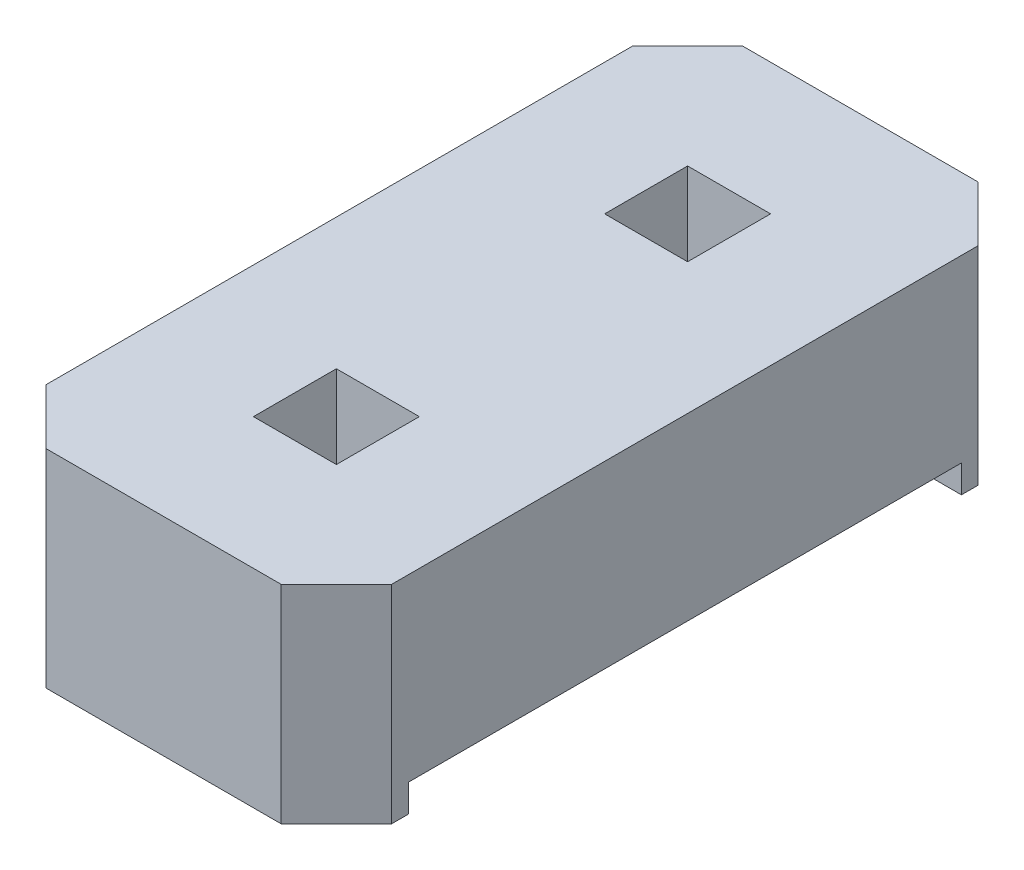
ISO-10303-21;
HEADER;
FILE_DESCRIPTION(('STEP AP214'),'2;1');
FILE_NAME('part.step','',(''),(''),'','','');
FILE_SCHEMA(('AUTOMOTIVE_DESIGN { 1 0 10303 214 1 1 1 1 }'));
ENDSEC;
DATA;
#1=APPLICATION_CONTEXT('core data for automotive mechanical design processes');
#2=APPLICATION_PROTOCOL_DEFINITION('international standard','automotive_design',2000,#1);
#3=PRODUCT_CONTEXT('',#1,'mechanical');
#4=PRODUCT('Part','Part','',(#3));
#5=PRODUCT_RELATED_PRODUCT_CATEGORY('part','',(#4));
#6=PRODUCT_DEFINITION_FORMATION('','',#4);
#7=PRODUCT_DEFINITION_CONTEXT('part definition',#1,'design');
#8=PRODUCT_DEFINITION('design','',#6,#7);
#9=PRODUCT_DEFINITION_SHAPE('','',#8);
#10=(LENGTH_UNIT() NAMED_UNIT(*) SI_UNIT(.MILLI.,.METRE.));
#11=(NAMED_UNIT(*) PLANE_ANGLE_UNIT() SI_UNIT($,.RADIAN.));
#12=(NAMED_UNIT(*) SI_UNIT($,.STERADIAN.) SOLID_ANGLE_UNIT());
#13=UNCERTAINTY_MEASURE_WITH_UNIT(LENGTH_MEASURE(1.E-05),#10,'distance_accuracy_value','');
#14=(GEOMETRIC_REPRESENTATION_CONTEXT(3) GLOBAL_UNCERTAINTY_ASSIGNED_CONTEXT((#13)) GLOBAL_UNIT_ASSIGNED_CONTEXT((#10,
#11,#12)) REPRESENTATION_CONTEXT('',''));
#15=CARTESIAN_POINT('',(0.,0.,0.));
#16=DIRECTION('',(0.,0.,1.));
#17=DIRECTION('',(1.,0.,0.));
#18=AXIS2_PLACEMENT_3D('',#15,#16,#17);
#19=CARTESIAN_POINT('',(0.,0.,0.));
#20=DIRECTION('',(0.,-1.,0.));
#21=DIRECTION('',(0.,0.,-1.));
#22=AXIS2_PLACEMENT_3D('',#19,#20,#21);
#23=PLANE('',#22);
#24=DIRECTION('',(-1.,0.,0.));
#25=VECTOR('',#24,1.);
#26=CARTESIAN_POINT('',(0.,0.,2.));
#27=LINE('',#26,#25);
#28=CARTESIAN_POINT('',(1.25,0.,2.));
#29=VERTEX_POINT('',#28);
#30=CARTESIAN_POINT('',(-1.25,0.,2.));
#31=VERTEX_POINT('',#30);
#32=EDGE_CURVE('E340',#29,#31,#27,.T.);
#33=ORIENTED_EDGE('',*,*,#32,.F.);
#34=DIRECTION('',(0.,0.,-1.));
#35=VECTOR('',#34,1.);
#36=CARTESIAN_POINT('',(1.25,0.,2.12));
#37=LINE('',#36,#35);
#38=CARTESIAN_POINT('',(1.25,0.,2.12));
#39=VERTEX_POINT('',#38);
#40=EDGE_CURVE('E190',#39,#29,#37,.T.);
#41=ORIENTED_EDGE('',*,*,#40,.F.);
#42=DIRECTION('',(0.707106781186547,0.,-0.707106781186548));
#43=VECTOR('',#42,1.);
#44=CARTESIAN_POINT('',(0.850000000000001,0.,2.52));
#45=LINE('',#44,#43);
#46=CARTESIAN_POINT('',(0.850000000000001,0.,2.52));
#47=VERTEX_POINT('',#46);
#48=EDGE_CURVE('E201',#47,#39,#45,.T.);
#49=ORIENTED_EDGE('',*,*,#48,.F.);
#50=DIRECTION('',(1.,0.,0.));
#51=VECTOR('',#50,1.);
#52=CARTESIAN_POINT('',(-0.85,0.,2.52));
#53=LINE('',#52,#51);
#54=CARTESIAN_POINT('',(-0.85,0.,2.52));
#55=VERTEX_POINT('',#54);
#56=EDGE_CURVE('E307',#55,#47,#53,.T.);
#57=ORIENTED_EDGE('',*,*,#56,.F.);
#58=DIRECTION('',(0.707106781186547,0.,0.707106781186548));
#59=VECTOR('',#58,1.);
#60=CARTESIAN_POINT('',(-1.25,0.,2.12));
#61=LINE('',#60,#59);
#62=CARTESIAN_POINT('',(-1.25,0.,2.12));
#63=VERTEX_POINT('',#62);
#64=EDGE_CURVE('E306',#63,#55,#61,.T.);
#65=ORIENTED_EDGE('',*,*,#64,.F.);
#66=DIRECTION('',(0.,0.,1.));
#67=VECTOR('',#66,1.);
#68=CARTESIAN_POINT('',(-1.25,0.,2.12));
#69=LINE('',#68,#67);
#70=EDGE_CURVE('E287',#31,#63,#69,.T.);
#71=ORIENTED_EDGE('',*,*,#70,.F.);
#72=EDGE_LOOP('',(#33,#41,#49,#57,#65,#71));
#73=FACE_BOUND('',#72,.T.);
#74=ADVANCED_FACE('F33',(#73),#23,.T.);
#75=CARTESIAN_POINT('',(0.,1.5,0.));
#76=DIRECTION('',(0.,-1.,0.));
#77=DIRECTION('',(0.,0.,-1.));
#78=AXIS2_PLACEMENT_3D('',#75,#76,#77);
#79=PLANE('',#78);
#80=DIRECTION('',(0.,0.,1.));
#81=VECTOR('',#80,1.);
#82=CARTESIAN_POINT('',(-0.3,1.5,0.97));
#83=LINE('',#82,#81);
#84=CARTESIAN_POINT('',(-0.3,1.5,0.97));
#85=VERTEX_POINT('',#84);
#86=CARTESIAN_POINT('',(-0.3,1.5,1.57));
#87=VERTEX_POINT('',#86);
#88=EDGE_CURVE('E266',#85,#87,#83,.T.);
#89=ORIENTED_EDGE('',*,*,#88,.F.);
#90=DIRECTION('',(-1.,0.,0.));
#91=VECTOR('',#90,1.);
#92=CARTESIAN_POINT('',(0.3,1.5,0.97));
#93=LINE('',#92,#91);
#94=CARTESIAN_POINT('',(0.3,1.5,0.97));
#95=VERTEX_POINT('',#94);
#96=EDGE_CURVE('E273',#95,#85,#93,.T.);
#97=ORIENTED_EDGE('',*,*,#96,.F.);
#98=DIRECTION('',(0.,0.,-1.));
#99=VECTOR('',#98,1.);
#100=CARTESIAN_POINT('',(0.3,1.5,0.97));
#101=LINE('',#100,#99);
#102=CARTESIAN_POINT('',(0.3,1.5,1.57));
#103=VERTEX_POINT('',#102);
#104=EDGE_CURVE('E270',#103,#95,#101,.T.);
#105=ORIENTED_EDGE('',*,*,#104,.F.);
#106=DIRECTION('',(1.,0.,0.));
#107=VECTOR('',#106,1.);
#108=CARTESIAN_POINT('',(0.3,1.5,1.57));
#109=LINE('',#108,#107);
#110=EDGE_CURVE('E268',#87,#103,#109,.T.);
#111=ORIENTED_EDGE('',*,*,#110,.F.);
#112=EDGE_LOOP('',(#89,#97,#105,#111));
#113=FACE_BOUND('',#112,.T.);
#114=DIRECTION('',(0.,0.,1.));
#115=VECTOR('',#114,1.);
#116=CARTESIAN_POINT('',(-1.25,1.5,2.12));
#117=LINE('',#116,#115);
#118=CARTESIAN_POINT('',(-1.25,1.5,-2.12));
#119=VERTEX_POINT('',#118);
#120=CARTESIAN_POINT('',(-1.25,1.5,2.12));
#121=VERTEX_POINT('',#120);
#122=EDGE_CURVE('E208',#119,#121,#117,.T.);
#123=ORIENTED_EDGE('',*,*,#122,.T.);
#124=DIRECTION('',(0.707106781186547,0.,0.707106781186548));
#125=VECTOR('',#124,1.);
#126=CARTESIAN_POINT('',(-1.25,1.5,2.12));
#127=LINE('',#126,#125);
#128=CARTESIAN_POINT('',(-0.85,1.5,2.52));
#129=VERTEX_POINT('',#128);
#130=EDGE_CURVE('E290',#121,#129,#127,.T.);
#131=ORIENTED_EDGE('',*,*,#130,.T.);
#132=DIRECTION('',(1.,0.,0.));
#133=VECTOR('',#132,1.);
#134=CARTESIAN_POINT('',(-0.85,1.5,2.52));
#135=LINE('',#134,#133);
#136=CARTESIAN_POINT('',(0.850000000000001,1.5,2.52));
#137=VERTEX_POINT('',#136);
#138=EDGE_CURVE('E292',#129,#137,#135,.T.);
#139=ORIENTED_EDGE('',*,*,#138,.T.);
#140=DIRECTION('',(0.707106781186547,0.,-0.707106781186548));
#141=VECTOR('',#140,1.);
#142=CARTESIAN_POINT('',(0.850000000000001,1.5,2.52));
#143=LINE('',#142,#141);
#144=CARTESIAN_POINT('',(1.25,1.5,2.12));
#145=VERTEX_POINT('',#144);
#146=EDGE_CURVE('E294',#137,#145,#143,.T.);
#147=ORIENTED_EDGE('',*,*,#146,.T.);
#148=DIRECTION('',(0.,0.,-1.));
#149=VECTOR('',#148,1.);
#150=CARTESIAN_POINT('',(1.25,1.5,2.12));
#151=LINE('',#150,#149);
#152=CARTESIAN_POINT('',(1.25,1.5,-2.12));
#153=VERTEX_POINT('',#152);
#154=EDGE_CURVE('E296',#145,#153,#151,.T.);
#155=ORIENTED_EDGE('',*,*,#154,.T.);
#156=DIRECTION('',(-0.707106781186547,0.,-0.707106781186548));
#157=VECTOR('',#156,1.);
#158=CARTESIAN_POINT('',(0.85,1.5,-2.52));
#159=LINE('',#158,#157);
#160=CARTESIAN_POINT('',(0.85,1.5,-2.52));
#161=VERTEX_POINT('',#160);
#162=EDGE_CURVE('E298',#153,#161,#159,.T.);
#163=ORIENTED_EDGE('',*,*,#162,.T.);
#164=DIRECTION('',(-1.,0.,0.));
#165=VECTOR('',#164,1.);
#166=CARTESIAN_POINT('',(-0.85,1.5,-2.52));
#167=LINE('',#166,#165);
#168=CARTESIAN_POINT('',(-0.85,1.5,-2.52));
#169=VERTEX_POINT('',#168);
#170=EDGE_CURVE('E300',#161,#169,#167,.T.);
#171=ORIENTED_EDGE('',*,*,#170,.T.);
#172=DIRECTION('',(-0.707106781186547,0.,0.707106781186548));
#173=VECTOR('',#172,1.);
#174=CARTESIAN_POINT('',(-1.25,1.5,-2.12));
#175=LINE('',#174,#173);
#176=EDGE_CURVE('E213',#169,#119,#175,.T.);
#177=ORIENTED_EDGE('',*,*,#176,.T.);
#178=EDGE_LOOP('',(#123,#131,#139,#147,#155,#163,#171,#177));
#179=FACE_BOUND('',#178,.T.);
#180=DIRECTION('',(1.,0.,0.));
#181=VECTOR('',#180,1.);
#182=CARTESIAN_POINT('',(0.3,1.5,-0.97));
#183=LINE('',#182,#181);
#184=CARTESIAN_POINT('',(-0.3,1.5,-0.97));
#185=VERTEX_POINT('',#184);
#186=CARTESIAN_POINT('',(0.3,1.5,-0.97));
#187=VERTEX_POINT('',#186);
#188=EDGE_CURVE('E342',#185,#187,#183,.T.);
#189=ORIENTED_EDGE('',*,*,#188,.F.);
#190=DIRECTION('',(0.,0.,1.));
#191=VECTOR('',#190,1.);
#192=CARTESIAN_POINT('',(-0.3,1.5,-0.97));
#193=LINE('',#192,#191);
#194=CARTESIAN_POINT('',(-0.3,1.5,-1.57));
#195=VERTEX_POINT('',#194);
#196=EDGE_CURVE('E254',#195,#185,#193,.T.);
#197=ORIENTED_EDGE('',*,*,#196,.F.);
#198=DIRECTION('',(-1.,0.,0.));
#199=VECTOR('',#198,1.);
#200=CARTESIAN_POINT('',(0.3,1.5,-1.57));
#201=LINE('',#200,#199);
#202=CARTESIAN_POINT('',(0.3,1.5,-1.57));
#203=VERTEX_POINT('',#202);
#204=EDGE_CURVE('E259',#203,#195,#201,.T.);
#205=ORIENTED_EDGE('',*,*,#204,.F.);
#206=DIRECTION('',(0.,0.,-1.));
#207=VECTOR('',#206,1.);
#208=CARTESIAN_POINT('',(0.3,1.5,-0.97));
#209=LINE('',#208,#207);
#210=EDGE_CURVE('E344',#187,#203,#209,.T.);
#211=ORIENTED_EDGE('',*,*,#210,.F.);
#212=EDGE_LOOP('',(#189,#197,#205,#211));
#213=FACE_BOUND('',#212,.T.);
#214=ADVANCED_FACE('F352',(#113,#179,#213),#79,.F.);
#215=DIRECTION('',(1.,0.,0.));
#216=VECTOR('',#215,1.);
#217=CARTESIAN_POINT('',(0.,0.,-2.));
#218=LINE('',#217,#216);
#219=CARTESIAN_POINT('',(-1.25,0.,-2.));
#220=VERTEX_POINT('',#219);
#221=CARTESIAN_POINT('',(1.25,0.,-2.));
#222=VERTEX_POINT('',#221);
#223=EDGE_CURVE('E338',#220,#222,#218,.T.);
#224=ORIENTED_EDGE('',*,*,#223,.F.);
#225=CARTESIAN_POINT('',(-1.25,0.,-2.12));
#226=VERTEX_POINT('',#225);
#227=EDGE_CURVE('E303',#226,#220,#69,.T.);
#228=ORIENTED_EDGE('',*,*,#227,.F.);
#229=DIRECTION('',(-0.707106781186547,0.,0.707106781186548));
#230=VECTOR('',#229,1.);
#231=CARTESIAN_POINT('',(-1.25,0.,-2.12));
#232=LINE('',#231,#230);
#233=CARTESIAN_POINT('',(-0.85,0.,-2.52));
#234=VERTEX_POINT('',#233);
#235=EDGE_CURVE('E206',#234,#226,#232,.T.);
#236=ORIENTED_EDGE('',*,*,#235,.F.);
#237=DIRECTION('',(-1.,0.,0.));
#238=VECTOR('',#237,1.);
#239=CARTESIAN_POINT('',(-0.85,0.,-2.52));
#240=LINE('',#239,#238);
#241=CARTESIAN_POINT('',(0.85,0.,-2.52));
#242=VERTEX_POINT('',#241);
#243=EDGE_CURVE('E199',#242,#234,#240,.T.);
#244=ORIENTED_EDGE('',*,*,#243,.F.);
#245=DIRECTION('',(-0.707106781186547,0.,-0.707106781186548));
#246=VECTOR('',#245,1.);
#247=CARTESIAN_POINT('',(0.85,0.,-2.52));
#248=LINE('',#247,#246);
#249=CARTESIAN_POINT('',(1.25,0.,-2.12));
#250=VERTEX_POINT('',#249);
#251=EDGE_CURVE('E196',#250,#242,#248,.T.);
#252=ORIENTED_EDGE('',*,*,#251,.F.);
#253=EDGE_CURVE('E197',#222,#250,#37,.T.);
#254=ORIENTED_EDGE('',*,*,#253,.F.);
#255=EDGE_LOOP('',(#224,#228,#236,#244,#252,#254));
#256=FACE_BOUND('',#255,.T.);
#257=ADVANCED_FACE('F366',(#256),#23,.T.);
#258=CARTESIAN_POINT('',(-1.25,1.5,2.12));
#259=DIRECTION('',(1.,0.,0.));
#260=DIRECTION('',(0.,0.,-1.));
#261=AXIS2_PLACEMENT_3D('',#258,#259,#260);
#262=PLANE('',#261);
#263=DIRECTION('',(0.,0.,-1.));
#264=VECTOR('',#263,1.);
#265=CARTESIAN_POINT('',(-1.25,0.2,-2.));
#266=LINE('',#265,#264);
#267=CARTESIAN_POINT('',(-1.25,0.2,2.));
#268=VERTEX_POINT('',#267);
#269=CARTESIAN_POINT('',(-1.25,0.2,-2.));
#270=VERTEX_POINT('',#269);
#271=EDGE_CURVE('E323',#268,#270,#266,.T.);
#272=ORIENTED_EDGE('',*,*,#271,.F.);
#273=DIRECTION('',(0.,1.,0.));
#274=VECTOR('',#273,1.);
#275=CARTESIAN_POINT('',(-1.25,-0.2,2.));
#276=LINE('',#275,#274);
#277=EDGE_CURVE('E174',#31,#268,#276,.T.);
#278=ORIENTED_EDGE('',*,*,#277,.F.);
#279=ORIENTED_EDGE('',*,*,#70,.T.);
#280=DIRECTION('',(0.,-1.,0.));
#281=VECTOR('',#280,1.);
#282=CARTESIAN_POINT('',(-1.25,1.5,2.12));
#283=LINE('',#282,#281);
#284=EDGE_CURVE('E229',#121,#63,#283,.T.);
#285=ORIENTED_EDGE('',*,*,#284,.F.);
#286=ORIENTED_EDGE('',*,*,#122,.F.);
#287=DIRECTION('',(0.,-1.,0.));
#288=VECTOR('',#287,1.);
#289=CARTESIAN_POINT('',(-1.25,1.5,-2.12));
#290=LINE('',#289,#288);
#291=EDGE_CURVE('E209',#119,#226,#290,.T.);
#292=ORIENTED_EDGE('',*,*,#291,.T.);
#293=ORIENTED_EDGE('',*,*,#227,.T.);
#294=DIRECTION('',(0.,-1.,0.));
#295=VECTOR('',#294,1.);
#296=CARTESIAN_POINT('',(-1.25,-0.2,-2.));
#297=LINE('',#296,#295);
#298=EDGE_CURVE('E184',#270,#220,#297,.T.);
#299=ORIENTED_EDGE('',*,*,#298,.F.);
#300=EDGE_LOOP('',(#272,#278,#279,#285,#286,#292,#293,#299));
#301=FACE_BOUND('',#300,.T.);
#302=ADVANCED_FACE('F35',(#301),#262,.F.);
#303=CARTESIAN_POINT('',(-1.25,1.5,2.12));
#304=DIRECTION('',(0.707106781186548,0.,-0.707106781186547));
#305=DIRECTION('',(-0.707106781186547,0.,-0.707106781186548));
#306=AXIS2_PLACEMENT_3D('',#303,#304,#305);
#307=PLANE('',#306);
#308=ORIENTED_EDGE('',*,*,#64,.T.);
#309=DIRECTION('',(0.,-1.,0.));
#310=VECTOR('',#309,1.);
#311=CARTESIAN_POINT('',(-0.85,1.5,2.52));
#312=LINE('',#311,#310);
#313=EDGE_CURVE('E226',#129,#55,#312,.T.);
#314=ORIENTED_EDGE('',*,*,#313,.F.);
#315=ORIENTED_EDGE('',*,*,#130,.F.);
#316=ORIENTED_EDGE('',*,*,#284,.T.);
#317=EDGE_LOOP('',(#308,#314,#315,#316));
#318=FACE_BOUND('',#317,.T.);
#319=ADVANCED_FACE('F319',(#318),#307,.F.);
#320=CARTESIAN_POINT('',(-0.85,1.5,2.52));
#321=DIRECTION('',(0.,0.,-1.));
#322=DIRECTION('',(-1.,0.,0.));
#323=AXIS2_PLACEMENT_3D('',#320,#321,#322);
#324=PLANE('',#323);
#325=ORIENTED_EDGE('',*,*,#56,.T.);
#326=DIRECTION('',(0.,-1.,0.));
#327=VECTOR('',#326,1.);
#328=CARTESIAN_POINT('',(0.850000000000001,1.5,2.52));
#329=LINE('',#328,#327);
#330=EDGE_CURVE('E223',#137,#47,#329,.T.);
#331=ORIENTED_EDGE('',*,*,#330,.F.);
#332=ORIENTED_EDGE('',*,*,#138,.F.);
#333=ORIENTED_EDGE('',*,*,#313,.T.);
#334=EDGE_LOOP('',(#325,#331,#332,#333));
#335=FACE_BOUND('',#334,.T.);
#336=ADVANCED_FACE('F399',(#335),#324,.F.);
#337=CARTESIAN_POINT('',(0.850000000000001,1.5,2.52));
#338=DIRECTION('',(-0.707106781186548,0.,-0.707106781186547));
#339=DIRECTION('',(-0.707106781186547,0.,0.707106781186548));
#340=AXIS2_PLACEMENT_3D('',#337,#338,#339);
#341=PLANE('',#340);
#342=ORIENTED_EDGE('',*,*,#48,.T.);
#343=DIRECTION('',(0.,-1.,0.));
#344=VECTOR('',#343,1.);
#345=CARTESIAN_POINT('',(1.25,1.5,2.12));
#346=LINE('',#345,#344);
#347=EDGE_CURVE('E193',#145,#39,#346,.T.);
#348=ORIENTED_EDGE('',*,*,#347,.F.);
#349=ORIENTED_EDGE('',*,*,#146,.F.);
#350=ORIENTED_EDGE('',*,*,#330,.T.);
#351=EDGE_LOOP('',(#342,#348,#349,#350));
#352=FACE_BOUND('',#351,.T.);
#353=ADVANCED_FACE('F312',(#352),#341,.F.);
#354=CARTESIAN_POINT('',(1.25,1.5,2.12));
#355=DIRECTION('',(-1.,0.,0.));
#356=DIRECTION('',(0.,0.,1.));
#357=AXIS2_PLACEMENT_3D('',#354,#355,#356);
#358=PLANE('',#357);
#359=ORIENTED_EDGE('',*,*,#40,.T.);
#360=DIRECTION('',(0.,1.,0.));
#361=VECTOR('',#360,1.);
#362=CARTESIAN_POINT('',(1.25,1.5,2.));
#363=LINE('',#362,#361);
#364=CARTESIAN_POINT('',(1.25,0.2,2.));
#365=VERTEX_POINT('',#364);
#366=EDGE_CURVE('E11',#29,#365,#363,.T.);
#367=ORIENTED_EDGE('',*,*,#366,.T.);
#368=DIRECTION('',(0.,0.,-1.));
#369=VECTOR('',#368,1.);
#370=CARTESIAN_POINT('',(1.25,0.2,-2.));
#371=LINE('',#370,#369);
#372=CARTESIAN_POINT('',(1.25,0.2,-2.));
#373=VERTEX_POINT('',#372);
#374=EDGE_CURVE('E181',#365,#373,#371,.T.);
#375=ORIENTED_EDGE('',*,*,#374,.T.);
#376=DIRECTION('',(0.,-1.,0.));
#377=VECTOR('',#376,1.);
#378=CARTESIAN_POINT('',(1.25,-0.2,-2.));
#379=LINE('',#378,#377);
#380=EDGE_CURVE('E48',#373,#222,#379,.T.);
#381=ORIENTED_EDGE('',*,*,#380,.T.);
#382=ORIENTED_EDGE('',*,*,#253,.T.);
#383=DIRECTION('',(0.,-1.,0.));
#384=VECTOR('',#383,1.);
#385=CARTESIAN_POINT('',(1.25,1.5,-2.12));
#386=LINE('',#385,#384);
#387=EDGE_CURVE('E219',#153,#250,#386,.T.);
#388=ORIENTED_EDGE('',*,*,#387,.F.);
#389=ORIENTED_EDGE('',*,*,#154,.F.);
#390=ORIENTED_EDGE('',*,*,#347,.T.);
#391=EDGE_LOOP('',(#359,#367,#375,#381,#382,#388,#389,#390));
#392=FACE_BOUND('',#391,.T.);
#393=ADVANCED_FACE('F187',(#392),#358,.F.);
#394=CARTESIAN_POINT('',(0.85,1.5,-2.52));
#395=DIRECTION('',(-0.707106781186548,0.,0.707106781186547));
#396=DIRECTION('',(0.707106781186547,0.,0.707106781186548));
#397=AXIS2_PLACEMENT_3D('',#394,#395,#396);
#398=PLANE('',#397);
#399=ORIENTED_EDGE('',*,*,#251,.T.);
#400=DIRECTION('',(0.,-1.,0.));
#401=VECTOR('',#400,1.);
#402=CARTESIAN_POINT('',(0.85,1.5,-2.52));
#403=LINE('',#402,#401);
#404=EDGE_CURVE('E216',#161,#242,#403,.T.);
#405=ORIENTED_EDGE('',*,*,#404,.F.);
#406=ORIENTED_EDGE('',*,*,#162,.F.);
#407=ORIENTED_EDGE('',*,*,#387,.T.);
#408=EDGE_LOOP('',(#399,#405,#406,#407));
#409=FACE_BOUND('',#408,.T.);
#410=ADVANCED_FACE('F395',(#409),#398,.F.);
#411=CARTESIAN_POINT('',(-0.85,1.5,-2.52));
#412=DIRECTION('',(0.,0.,1.));
#413=DIRECTION('',(1.,0.,0.));
#414=AXIS2_PLACEMENT_3D('',#411,#412,#413);
#415=PLANE('',#414);
#416=ORIENTED_EDGE('',*,*,#243,.T.);
#417=DIRECTION('',(0.,-1.,0.));
#418=VECTOR('',#417,1.);
#419=CARTESIAN_POINT('',(-0.85,1.5,-2.52));
#420=LINE('',#419,#418);
#421=EDGE_CURVE('E212',#169,#234,#420,.T.);
#422=ORIENTED_EDGE('',*,*,#421,.F.);
#423=ORIENTED_EDGE('',*,*,#170,.F.);
#424=ORIENTED_EDGE('',*,*,#404,.T.);
#425=EDGE_LOOP('',(#416,#422,#423,#424));
#426=FACE_BOUND('',#425,.T.);
#427=ADVANCED_FACE('F390',(#426),#415,.F.);
#428=CARTESIAN_POINT('',(-1.25,1.5,-2.12));
#429=DIRECTION('',(0.707106781186548,0.,0.707106781186547));
#430=DIRECTION('',(0.707106781186547,0.,-0.707106781186548));
#431=AXIS2_PLACEMENT_3D('',#428,#429,#430);
#432=PLANE('',#431);
#433=ORIENTED_EDGE('',*,*,#235,.T.);
#434=ORIENTED_EDGE('',*,*,#291,.F.);
#435=ORIENTED_EDGE('',*,*,#176,.F.);
#436=ORIENTED_EDGE('',*,*,#421,.T.);
#437=EDGE_LOOP('',(#433,#434,#435,#436));
#438=FACE_BOUND('',#437,.T.);
#439=ADVANCED_FACE('F386',(#438),#432,.F.);
#440=CARTESIAN_POINT('',(-0.3,1.5,0.97));
#441=DIRECTION('',(1.,0.,0.));
#442=DIRECTION('',(0.,0.,-1.));
#443=AXIS2_PLACEMENT_3D('',#440,#441,#442);
#444=PLANE('',#443);
#445=DIRECTION('',(0.,0.,1.));
#446=VECTOR('',#445,1.);
#447=CARTESIAN_POINT('',(-0.3,0.2,0.97));
#448=LINE('',#447,#446);
#449=CARTESIAN_POINT('',(-0.3,0.2,0.97));
#450=VERTEX_POINT('',#449);
#451=CARTESIAN_POINT('',(-0.3,0.2,1.57));
#452=VERTEX_POINT('',#451);
#453=EDGE_CURVE('E336',#450,#452,#448,.T.);
#454=ORIENTED_EDGE('',*,*,#453,.F.);
#455=DIRECTION('',(0.,-1.,0.));
#456=VECTOR('',#455,1.);
#457=CARTESIAN_POINT('',(-0.3,1.5,0.97));
#458=LINE('',#457,#456);
#459=EDGE_CURVE('E275',#85,#450,#458,.T.);
#460=ORIENTED_EDGE('',*,*,#459,.F.);
#461=ORIENTED_EDGE('',*,*,#88,.T.);
#462=DIRECTION('',(0.,-1.,0.));
#463=VECTOR('',#462,1.);
#464=CARTESIAN_POINT('',(-0.3,1.5,1.57));
#465=LINE('',#464,#463);
#466=EDGE_CURVE('E284',#87,#452,#465,.T.);
#467=ORIENTED_EDGE('',*,*,#466,.T.);
#468=EDGE_LOOP('',(#454,#460,#461,#467));
#469=FACE_BOUND('',#468,.T.);
#470=ADVANCED_FACE('F414',(#469),#444,.T.);
#471=CARTESIAN_POINT('',(0.3,1.5,1.57));
#472=DIRECTION('',(0.,0.,-1.));
#473=DIRECTION('',(-1.,0.,0.));
#474=AXIS2_PLACEMENT_3D('',#471,#472,#473);
#475=PLANE('',#474);
#476=DIRECTION('',(1.,0.,0.));
#477=VECTOR('',#476,1.);
#478=CARTESIAN_POINT('',(0.3,0.2,1.57));
#479=LINE('',#478,#477);
#480=CARTESIAN_POINT('',(0.3,0.2,1.57));
#481=VERTEX_POINT('',#480);
#482=EDGE_CURVE('E334',#452,#481,#479,.T.);
#483=ORIENTED_EDGE('',*,*,#482,.F.);
#484=ORIENTED_EDGE('',*,*,#466,.F.);
#485=ORIENTED_EDGE('',*,*,#110,.T.);
#486=DIRECTION('',(0.,-1.,0.));
#487=VECTOR('',#486,1.);
#488=CARTESIAN_POINT('',(0.3,1.5,1.57));
#489=LINE('',#488,#487);
#490=EDGE_CURVE('E281',#103,#481,#489,.T.);
#491=ORIENTED_EDGE('',*,*,#490,.T.);
#492=EDGE_LOOP('',(#483,#484,#485,#491));
#493=FACE_BOUND('',#492,.T.);
#494=ADVANCED_FACE('F418',(#493),#475,.T.);
#495=CARTESIAN_POINT('',(0.3,1.5,0.97));
#496=DIRECTION('',(-1.,0.,0.));
#497=DIRECTION('',(0.,0.,1.));
#498=AXIS2_PLACEMENT_3D('',#495,#496,#497);
#499=PLANE('',#498);
#500=DIRECTION('',(0.,0.,-1.));
#501=VECTOR('',#500,1.);
#502=CARTESIAN_POINT('',(0.3,0.2,0.97));
#503=LINE('',#502,#501);
#504=CARTESIAN_POINT('',(0.3,0.2,0.97));
#505=VERTEX_POINT('',#504);
#506=EDGE_CURVE('E56',#481,#505,#503,.T.);
#507=ORIENTED_EDGE('',*,*,#506,.F.);
#508=ORIENTED_EDGE('',*,*,#490,.F.);
#509=ORIENTED_EDGE('',*,*,#104,.T.);
#510=DIRECTION('',(0.,-1.,0.));
#511=VECTOR('',#510,1.);
#512=CARTESIAN_POINT('',(0.3,1.5,0.97));
#513=LINE('',#512,#511);
#514=EDGE_CURVE('E278',#95,#505,#513,.T.);
#515=ORIENTED_EDGE('',*,*,#514,.T.);
#516=EDGE_LOOP('',(#507,#508,#509,#515));
#517=FACE_BOUND('',#516,.T.);
#518=ADVANCED_FACE('F424',(#517),#499,.T.);
#519=CARTESIAN_POINT('',(0.3,1.5,0.97));
#520=DIRECTION('',(0.,0.,1.));
#521=DIRECTION('',(1.,0.,0.));
#522=AXIS2_PLACEMENT_3D('',#519,#520,#521);
#523=PLANE('',#522);
#524=DIRECTION('',(-1.,0.,0.));
#525=VECTOR('',#524,1.);
#526=CARTESIAN_POINT('',(0.3,0.2,0.97));
#527=LINE('',#526,#525);
#528=EDGE_CURVE('E249',#505,#450,#527,.T.);
#529=ORIENTED_EDGE('',*,*,#528,.F.);
#530=ORIENTED_EDGE('',*,*,#514,.F.);
#531=ORIENTED_EDGE('',*,*,#96,.T.);
#532=ORIENTED_EDGE('',*,*,#459,.T.);
#533=EDGE_LOOP('',(#529,#530,#531,#532));
#534=FACE_BOUND('',#533,.T.);
#535=ADVANCED_FACE('F362',(#534),#523,.T.);
#536=CARTESIAN_POINT('',(0.3,1.5,-0.97));
#537=DIRECTION('',(0.,0.,-1.));
#538=DIRECTION('',(-1.,0.,0.));
#539=AXIS2_PLACEMENT_3D('',#536,#537,#538);
#540=PLANE('',#539);
#541=DIRECTION('',(1.,0.,0.));
#542=VECTOR('',#541,1.);
#543=CARTESIAN_POINT('',(0.3,0.2,-0.97));
#544=LINE('',#543,#542);
#545=CARTESIAN_POINT('',(-0.3,0.2,-0.97));
#546=VERTEX_POINT('',#545);
#547=CARTESIAN_POINT('',(0.3,0.2,-0.97));
#548=VERTEX_POINT('',#547);
#549=EDGE_CURVE('E234',#546,#548,#544,.T.);
#550=ORIENTED_EDGE('',*,*,#549,.F.);
#551=DIRECTION('',(0.,-1.,0.));
#552=VECTOR('',#551,1.);
#553=CARTESIAN_POINT('',(-0.3,1.5,-0.97));
#554=LINE('',#553,#552);
#555=EDGE_CURVE('E245',#185,#546,#554,.T.);
#556=ORIENTED_EDGE('',*,*,#555,.F.);
#557=ORIENTED_EDGE('',*,*,#188,.T.);
#558=DIRECTION('',(0.,-1.,0.));
#559=VECTOR('',#558,1.);
#560=CARTESIAN_POINT('',(0.3,1.5,-0.97));
#561=LINE('',#560,#559);
#562=EDGE_CURVE('E248',#187,#548,#561,.T.);
#563=ORIENTED_EDGE('',*,*,#562,.T.);
#564=EDGE_LOOP('',(#550,#556,#557,#563));
#565=FACE_BOUND('',#564,.T.);
#566=ADVANCED_FACE('F244',(#565),#540,.T.);
#567=CARTESIAN_POINT('',(0.3,1.5,-0.97));
#568=DIRECTION('',(-1.,0.,0.));
#569=DIRECTION('',(0.,0.,1.));
#570=AXIS2_PLACEMENT_3D('',#567,#568,#569);
#571=PLANE('',#570);
#572=DIRECTION('',(0.,0.,-1.));
#573=VECTOR('',#572,1.);
#574=CARTESIAN_POINT('',(0.3,0.2,-0.97));
#575=LINE('',#574,#573);
#576=CARTESIAN_POINT('',(0.3,0.2,-1.57));
#577=VERTEX_POINT('',#576);
#578=EDGE_CURVE('E250',#548,#577,#575,.T.);
#579=ORIENTED_EDGE('',*,*,#578,.F.);
#580=ORIENTED_EDGE('',*,*,#562,.F.);
#581=ORIENTED_EDGE('',*,*,#210,.T.);
#582=DIRECTION('',(0.,-1.,0.));
#583=VECTOR('',#582,1.);
#584=CARTESIAN_POINT('',(0.3,1.5,-1.57));
#585=LINE('',#584,#583);
#586=EDGE_CURVE('E257',#203,#577,#585,.T.);
#587=ORIENTED_EDGE('',*,*,#586,.T.);
#588=EDGE_LOOP('',(#579,#580,#581,#587));
#589=FACE_BOUND('',#588,.T.);
#590=ADVANCED_FACE('F354',(#589),#571,.T.);
#591=CARTESIAN_POINT('',(0.3,1.5,-1.57));
#592=DIRECTION('',(0.,0.,1.));
#593=DIRECTION('',(1.,0.,0.));
#594=AXIS2_PLACEMENT_3D('',#591,#592,#593);
#595=PLANE('',#594);
#596=DIRECTION('',(-1.,0.,0.));
#597=VECTOR('',#596,1.);
#598=CARTESIAN_POINT('',(0.3,0.2,-1.57));
#599=LINE('',#598,#597);
#600=CARTESIAN_POINT('',(-0.3,0.2,-1.57));
#601=VERTEX_POINT('',#600);
#602=EDGE_CURVE('E237',#577,#601,#599,.T.);
#603=ORIENTED_EDGE('',*,*,#602,.F.);
#604=ORIENTED_EDGE('',*,*,#586,.F.);
#605=ORIENTED_EDGE('',*,*,#204,.T.);
#606=DIRECTION('',(0.,-1.,0.));
#607=VECTOR('',#606,1.);
#608=CARTESIAN_POINT('',(-0.3,1.5,-1.57));
#609=LINE('',#608,#607);
#610=EDGE_CURVE('E255',#195,#601,#609,.T.);
#611=ORIENTED_EDGE('',*,*,#610,.T.);
#612=EDGE_LOOP('',(#603,#604,#605,#611));
#613=FACE_BOUND('',#612,.T.);
#614=ADVANCED_FACE('F349',(#613),#595,.T.);
#615=CARTESIAN_POINT('',(-0.3,1.5,-0.97));
#616=DIRECTION('',(1.,0.,0.));
#617=DIRECTION('',(0.,0.,-1.));
#618=AXIS2_PLACEMENT_3D('',#615,#616,#617);
#619=PLANE('',#618);
#620=DIRECTION('',(0.,0.,1.));
#621=VECTOR('',#620,1.);
#622=CARTESIAN_POINT('',(-0.3,0.2,-0.97));
#623=LINE('',#622,#621);
#624=EDGE_CURVE('E41',#601,#546,#623,.T.);
#625=ORIENTED_EDGE('',*,*,#624,.F.);
#626=ORIENTED_EDGE('',*,*,#610,.F.);
#627=ORIENTED_EDGE('',*,*,#196,.T.);
#628=ORIENTED_EDGE('',*,*,#555,.T.);
#629=EDGE_LOOP('',(#625,#626,#627,#628));
#630=FACE_BOUND('',#629,.T.);
#631=ADVANCED_FACE('F252',(#630),#619,.T.);
#632=CARTESIAN_POINT('',(1.25,-0.2,2.));
#633=DIRECTION('',(0.,0.,1.));
#634=DIRECTION('',(1.,0.,0.));
#635=AXIS2_PLACEMENT_3D('',#632,#633,#634);
#636=PLANE('',#635);
#637=ORIENTED_EDGE('',*,*,#32,.T.);
#638=ORIENTED_EDGE('',*,*,#277,.T.);
#639=DIRECTION('',(-1.,0.,0.));
#640=VECTOR('',#639,1.);
#641=CARTESIAN_POINT('',(1.25,0.2,2.));
#642=LINE('',#641,#640);
#643=EDGE_CURVE('E169',#365,#268,#642,.T.);
#644=ORIENTED_EDGE('',*,*,#643,.F.);
#645=ORIENTED_EDGE('',*,*,#366,.F.);
#646=EDGE_LOOP('',(#637,#638,#644,#645));
#647=FACE_BOUND('',#646,.T.);
#648=ADVANCED_FACE('F171',(#647),#636,.F.);
#649=CARTESIAN_POINT('',(1.25,-0.2,-2.));
#650=DIRECTION('',(0.,0.,-1.));
#651=DIRECTION('',(-1.,0.,0.));
#652=AXIS2_PLACEMENT_3D('',#649,#650,#651);
#653=PLANE('',#652);
#654=ORIENTED_EDGE('',*,*,#223,.T.);
#655=ORIENTED_EDGE('',*,*,#380,.F.);
#656=DIRECTION('',(-1.,0.,0.));
#657=VECTOR('',#656,1.);
#658=CARTESIAN_POINT('',(1.25,0.2,-2.));
#659=LINE('',#658,#657);
#660=EDGE_CURVE('E178',#373,#270,#659,.T.);
#661=ORIENTED_EDGE('',*,*,#660,.T.);
#662=ORIENTED_EDGE('',*,*,#298,.T.);
#663=EDGE_LOOP('',(#654,#655,#661,#662));
#664=FACE_BOUND('',#663,.T.);
#665=ADVANCED_FACE('F445',(#664),#653,.F.);
#666=CARTESIAN_POINT('',(1.25,0.2,-2.));
#667=DIRECTION('',(0.,1.,0.));
#668=DIRECTION('',(0.,0.,1.));
#669=AXIS2_PLACEMENT_3D('',#666,#667,#668);
#670=PLANE('',#669);
#671=ORIENTED_EDGE('',*,*,#453,.T.);
#672=ORIENTED_EDGE('',*,*,#482,.T.);
#673=ORIENTED_EDGE('',*,*,#506,.T.);
#674=ORIENTED_EDGE('',*,*,#528,.T.);
#675=EDGE_LOOP('',(#671,#672,#673,#674));
#676=FACE_BOUND('',#675,.T.);
#677=ORIENTED_EDGE('',*,*,#549,.T.);
#678=ORIENTED_EDGE('',*,*,#578,.T.);
#679=ORIENTED_EDGE('',*,*,#602,.T.);
#680=ORIENTED_EDGE('',*,*,#624,.T.);
#681=EDGE_LOOP('',(#677,#678,#679,#680));
#682=FACE_BOUND('',#681,.T.);
#683=ORIENTED_EDGE('',*,*,#271,.T.);
#684=ORIENTED_EDGE('',*,*,#660,.F.);
#685=ORIENTED_EDGE('',*,*,#374,.F.);
#686=ORIENTED_EDGE('',*,*,#643,.T.);
#687=EDGE_LOOP('',(#683,#684,#685,#686));
#688=FACE_BOUND('',#687,.T.);
#689=ADVANCED_FACE('F182',(#676,#682,#688),#670,.F.);
#690=CLOSED_SHELL('',(#74,#214,#257,#302,#319,#336,#353,#393,#410,#427,#439,#470,#494,#518,#535,
#566,#590,#614,#631,#648,#665,#689));
#691=MANIFOLD_SOLID_BREP('B2',#690);
#692=ADVANCED_BREP_SHAPE_REPRESENTATION('',(#18,#691),#14);
#693=SHAPE_DEFINITION_REPRESENTATION(#9,#692);
ENDSEC;
END-ISO-10303-21;
